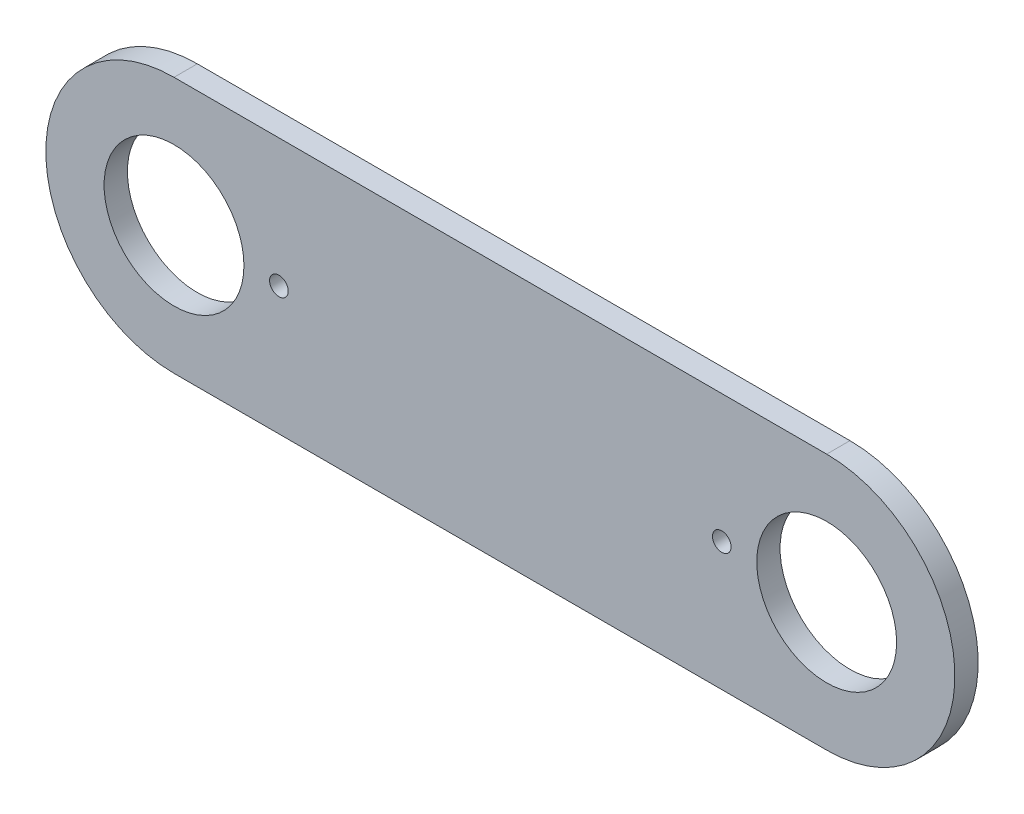
ISO-10303-21;
HEADER;
FILE_DESCRIPTION(('STEP AP214'),'2;1');
FILE_NAME('part.step','',(''),(''),'','','');
FILE_SCHEMA(('AUTOMOTIVE_DESIGN { 1 0 10303 214 1 1 1 1 }'));
ENDSEC;
DATA;
#1=APPLICATION_CONTEXT('core data for automotive mechanical design processes');
#2=APPLICATION_PROTOCOL_DEFINITION('international standard','automotive_design',2000,#1);
#3=PRODUCT_CONTEXT('',#1,'mechanical');
#4=PRODUCT('Part','Part','',(#3));
#5=PRODUCT_RELATED_PRODUCT_CATEGORY('part','',(#4));
#6=PRODUCT_DEFINITION_FORMATION('','',#4);
#7=PRODUCT_DEFINITION_CONTEXT('part definition',#1,'design');
#8=PRODUCT_DEFINITION('design','',#6,#7);
#9=PRODUCT_DEFINITION_SHAPE('','',#8);
#10=(LENGTH_UNIT() NAMED_UNIT(*) SI_UNIT(.MILLI.,.METRE.));
#11=(NAMED_UNIT(*) PLANE_ANGLE_UNIT() SI_UNIT($,.RADIAN.));
#12=(NAMED_UNIT(*) SI_UNIT($,.STERADIAN.) SOLID_ANGLE_UNIT());
#13=UNCERTAINTY_MEASURE_WITH_UNIT(LENGTH_MEASURE(1.E-05),#10,'distance_accuracy_value','');
#14=(GEOMETRIC_REPRESENTATION_CONTEXT(3) GLOBAL_UNCERTAINTY_ASSIGNED_CONTEXT((#13)) GLOBAL_UNIT_ASSIGNED_CONTEXT((#10,
#11,#12)) REPRESENTATION_CONTEXT('',''));
#15=CARTESIAN_POINT('',(0.,0.,0.));
#16=DIRECTION('',(0.,0.,1.));
#17=DIRECTION('',(1.,0.,0.));
#18=AXIS2_PLACEMENT_3D('',#15,#16,#17);
#19=CARTESIAN_POINT('',(0.,0.,5.));
#20=DIRECTION('',(0.,0.,1.));
#21=DIRECTION('',(1.,0.,0.));
#22=AXIS2_PLACEMENT_3D('',#19,#20,#21);
#23=PLANE('',#22);
#24=CARTESIAN_POINT('',(22.5,0.,5.));
#25=DIRECTION('',(0.,0.,1.));
#26=DIRECTION('',(1.,0.,0.));
#27=AXIS2_PLACEMENT_3D('',#24,#25,#26);
#28=CIRCLE('',#27,2.);
#29=CARTESIAN_POINT('',(24.5,0.,5.));
#30=VERTEX_POINT('',#29);
#31=EDGE_CURVE('E131',#30,#30,#28,.T.);
#32=ORIENTED_EDGE('',*,*,#31,.F.);
#33=EDGE_LOOP('',(#32));
#34=FACE_BOUND('',#33,.T.);
#35=CARTESIAN_POINT('',(0.,0.,5.));
#36=DIRECTION('',(0.,0.,1.));
#37=DIRECTION('',(1.,0.,0.));
#38=AXIS2_PLACEMENT_3D('',#35,#36,#37);
#39=CIRCLE('',#38,15.);
#40=CARTESIAN_POINT('',(15.,0.,5.));
#41=VERTEX_POINT('',#40);
#42=EDGE_CURVE('E110',#41,#41,#39,.T.);
#43=ORIENTED_EDGE('',*,*,#42,.F.);
#44=EDGE_LOOP('',(#43));
#45=FACE_BOUND('',#44,.T.);
#46=CARTESIAN_POINT('',(0.,0.,5.));
#47=DIRECTION('',(0.,0.,1.));
#48=DIRECTION('',(1.,0.,0.));
#49=AXIS2_PLACEMENT_3D('',#46,#47,#48);
#50=CIRCLE('',#49,27.5);
#51=CARTESIAN_POINT('',(0.,27.5,5.));
#52=VERTEX_POINT('',#51);
#53=CARTESIAN_POINT('',(0.,-27.5,5.));
#54=VERTEX_POINT('',#53);
#55=EDGE_CURVE('E95',#52,#54,#50,.T.);
#56=ORIENTED_EDGE('',*,*,#55,.T.);
#57=DIRECTION('',(1.,0.,0.));
#58=VECTOR('',#57,1.);
#59=CARTESIAN_POINT('',(0.,-27.5,5.));
#60=LINE('',#59,#58);
#61=CARTESIAN_POINT('',(140.,-27.5,5.));
#62=VERTEX_POINT('',#61);
#63=EDGE_CURVE('E90',#54,#62,#60,.T.);
#64=ORIENTED_EDGE('',*,*,#63,.T.);
#65=CARTESIAN_POINT('',(140.,0.,5.));
#66=DIRECTION('',(0.,0.,1.));
#67=DIRECTION('',(1.,0.,0.));
#68=AXIS2_PLACEMENT_3D('',#65,#66,#67);
#69=CIRCLE('',#68,27.5);
#70=CARTESIAN_POINT('',(140.,27.5,5.));
#71=VERTEX_POINT('',#70);
#72=EDGE_CURVE('E93',#62,#71,#69,.T.);
#73=ORIENTED_EDGE('',*,*,#72,.T.);
#74=DIRECTION('',(-1.,0.,0.));
#75=VECTOR('',#74,1.);
#76=CARTESIAN_POINT('',(0.,27.5,5.));
#77=LINE('',#76,#75);
#78=EDGE_CURVE('E60',#71,#52,#77,.T.);
#79=ORIENTED_EDGE('',*,*,#78,.T.);
#80=EDGE_LOOP('',(#56,#64,#73,#79));
#81=FACE_BOUND('',#80,.T.);
#82=CARTESIAN_POINT('',(140.,0.,5.));
#83=DIRECTION('',(0.,0.,1.));
#84=DIRECTION('',(1.,0.,0.));
#85=AXIS2_PLACEMENT_3D('',#82,#83,#84);
#86=CIRCLE('',#85,15.);
#87=CARTESIAN_POINT('',(155.,0.,5.));
#88=VERTEX_POINT('',#87);
#89=EDGE_CURVE('E125',#88,#88,#86,.T.);
#90=ORIENTED_EDGE('',*,*,#89,.F.);
#91=EDGE_LOOP('',(#90));
#92=FACE_BOUND('',#91,.T.);
#93=CARTESIAN_POINT('',(117.5,0.,5.));
#94=DIRECTION('',(0.,0.,1.));
#95=DIRECTION('',(1.,0.,0.));
#96=AXIS2_PLACEMENT_3D('',#93,#94,#95);
#97=CIRCLE('',#96,2.);
#98=CARTESIAN_POINT('',(119.5,0.,5.));
#99=VERTEX_POINT('',#98);
#100=EDGE_CURVE('E137',#99,#99,#97,.T.);
#101=ORIENTED_EDGE('',*,*,#100,.F.);
#102=EDGE_LOOP('',(#101));
#103=FACE_BOUND('',#102,.T.);
#104=ADVANCED_FACE('F43',(#34,#45,#81,#92,#103),#23,.T.);
#105=CARTESIAN_POINT('',(0.,0.,0.));
#106=DIRECTION('',(0.,0.,1.));
#107=DIRECTION('',(1.,0.,0.));
#108=AXIS2_PLACEMENT_3D('',#105,#106,#107);
#109=PLANE('',#108);
#110=CARTESIAN_POINT('',(0.,0.,0.));
#111=DIRECTION('',(0.,0.,1.));
#112=DIRECTION('',(1.,0.,0.));
#113=AXIS2_PLACEMENT_3D('',#110,#111,#112);
#114=CIRCLE('',#113,27.5);
#115=CARTESIAN_POINT('',(0.,27.5,0.));
#116=VERTEX_POINT('',#115);
#117=CARTESIAN_POINT('',(0.,-27.5,0.));
#118=VERTEX_POINT('',#117);
#119=EDGE_CURVE('E107',#116,#118,#114,.T.);
#120=ORIENTED_EDGE('',*,*,#119,.F.);
#121=DIRECTION('',(-1.,0.,0.));
#122=VECTOR('',#121,1.);
#123=CARTESIAN_POINT('',(0.,27.5,0.));
#124=LINE('',#123,#122);
#125=CARTESIAN_POINT('',(140.,27.5,0.));
#126=VERTEX_POINT('',#125);
#127=EDGE_CURVE('E83',#126,#116,#124,.T.);
#128=ORIENTED_EDGE('',*,*,#127,.F.);
#129=CARTESIAN_POINT('',(140.,0.,0.));
#130=DIRECTION('',(0.,0.,1.));
#131=DIRECTION('',(1.,0.,0.));
#132=AXIS2_PLACEMENT_3D('',#129,#130,#131);
#133=CIRCLE('',#132,27.5);
#134=CARTESIAN_POINT('',(140.,-27.5,0.));
#135=VERTEX_POINT('',#134);
#136=EDGE_CURVE('E77',#135,#126,#133,.T.);
#137=ORIENTED_EDGE('',*,*,#136,.F.);
#138=DIRECTION('',(1.,0.,0.));
#139=VECTOR('',#138,1.);
#140=CARTESIAN_POINT('',(0.,-27.5,0.));
#141=LINE('',#140,#139);
#142=EDGE_CURVE('E99',#118,#135,#141,.T.);
#143=ORIENTED_EDGE('',*,*,#142,.F.);
#144=EDGE_LOOP('',(#120,#128,#137,#143));
#145=FACE_BOUND('',#144,.T.);
#146=CARTESIAN_POINT('',(0.,0.,0.));
#147=DIRECTION('',(0.,0.,1.));
#148=DIRECTION('',(1.,0.,0.));
#149=AXIS2_PLACEMENT_3D('',#146,#147,#148);
#150=CIRCLE('',#149,15.);
#151=CARTESIAN_POINT('',(15.,0.,0.));
#152=VERTEX_POINT('',#151);
#153=EDGE_CURVE('E122',#152,#152,#150,.T.);
#154=ORIENTED_EDGE('',*,*,#153,.T.);
#155=EDGE_LOOP('',(#154));
#156=FACE_BOUND('',#155,.T.);
#157=CARTESIAN_POINT('',(140.,0.,0.));
#158=DIRECTION('',(0.,0.,1.));
#159=DIRECTION('',(1.,0.,0.));
#160=AXIS2_PLACEMENT_3D('',#157,#158,#159);
#161=CIRCLE('',#160,15.);
#162=CARTESIAN_POINT('',(155.,0.,0.));
#163=VERTEX_POINT('',#162);
#164=EDGE_CURVE('E128',#163,#163,#161,.T.);
#165=ORIENTED_EDGE('',*,*,#164,.T.);
#166=EDGE_LOOP('',(#165));
#167=FACE_BOUND('',#166,.T.);
#168=CARTESIAN_POINT('',(22.5,0.,0.));
#169=DIRECTION('',(0.,0.,1.));
#170=DIRECTION('',(1.,0.,0.));
#171=AXIS2_PLACEMENT_3D('',#168,#169,#170);
#172=CIRCLE('',#171,2.);
#173=CARTESIAN_POINT('',(24.5,0.,0.));
#174=VERTEX_POINT('',#173);
#175=EDGE_CURVE('E134',#174,#174,#172,.T.);
#176=ORIENTED_EDGE('',*,*,#175,.T.);
#177=EDGE_LOOP('',(#176));
#178=FACE_BOUND('',#177,.T.);
#179=CARTESIAN_POINT('',(117.5,0.,0.));
#180=DIRECTION('',(0.,0.,1.));
#181=DIRECTION('',(1.,0.,0.));
#182=AXIS2_PLACEMENT_3D('',#179,#180,#181);
#183=CIRCLE('',#182,2.);
#184=CARTESIAN_POINT('',(119.5,0.,0.));
#185=VERTEX_POINT('',#184);
#186=EDGE_CURVE('E140',#185,#185,#183,.T.);
#187=ORIENTED_EDGE('',*,*,#186,.T.);
#188=EDGE_LOOP('',(#187));
#189=FACE_BOUND('',#188,.T.);
#190=ADVANCED_FACE('F118',(#145,#156,#167,#178,#189),#109,.F.);
#191=CARTESIAN_POINT('',(0.,0.,5.));
#192=DIRECTION('',(0.,0.,-1.));
#193=DIRECTION('',(-1.,0.,0.));
#194=AXIS2_PLACEMENT_3D('',#191,#192,#193);
#195=CYLINDRICAL_SURFACE('',#194,27.5);
#196=ORIENTED_EDGE('',*,*,#119,.T.);
#197=DIRECTION('',(0.,0.,-1.));
#198=VECTOR('',#197,1.);
#199=CARTESIAN_POINT('',(0.,-27.5,5.));
#200=LINE('',#199,#198);
#201=EDGE_CURVE('E11',#54,#118,#200,.T.);
#202=ORIENTED_EDGE('',*,*,#201,.F.);
#203=ORIENTED_EDGE('',*,*,#55,.F.);
#204=DIRECTION('',(0.,0.,-1.));
#205=VECTOR('',#204,1.);
#206=CARTESIAN_POINT('',(0.,27.5,5.));
#207=LINE('',#206,#205);
#208=EDGE_CURVE('E103',#52,#116,#207,.T.);
#209=ORIENTED_EDGE('',*,*,#208,.T.);
#210=EDGE_LOOP('',(#196,#202,#203,#209));
#211=FACE_BOUND('',#210,.T.);
#212=ADVANCED_FACE('F45',(#211),#195,.T.);
#213=CARTESIAN_POINT('',(0.,-27.5,5.));
#214=DIRECTION('',(0.,1.,0.));
#215=DIRECTION('',(0.,0.,1.));
#216=AXIS2_PLACEMENT_3D('',#213,#214,#215);
#217=PLANE('',#216);
#218=ORIENTED_EDGE('',*,*,#142,.T.);
#219=DIRECTION('',(0.,0.,-1.));
#220=VECTOR('',#219,1.);
#221=CARTESIAN_POINT('',(140.,-27.5,5.));
#222=LINE('',#221,#220);
#223=EDGE_CURVE('E52',#62,#135,#222,.T.);
#224=ORIENTED_EDGE('',*,*,#223,.F.);
#225=ORIENTED_EDGE('',*,*,#63,.F.);
#226=ORIENTED_EDGE('',*,*,#201,.T.);
#227=EDGE_LOOP('',(#218,#224,#225,#226));
#228=FACE_BOUND('',#227,.T.);
#229=ADVANCED_FACE('F98',(#228),#217,.F.);
#230=CARTESIAN_POINT('',(140.,0.,5.));
#231=DIRECTION('',(0.,0.,-1.));
#232=DIRECTION('',(-1.,0.,0.));
#233=AXIS2_PLACEMENT_3D('',#230,#231,#232);
#234=CYLINDRICAL_SURFACE('',#233,27.5);
#235=ORIENTED_EDGE('',*,*,#136,.T.);
#236=DIRECTION('',(0.,0.,-1.));
#237=VECTOR('',#236,1.);
#238=CARTESIAN_POINT('',(140.,27.5,5.));
#239=LINE('',#238,#237);
#240=EDGE_CURVE('E100',#71,#126,#239,.T.);
#241=ORIENTED_EDGE('',*,*,#240,.F.);
#242=ORIENTED_EDGE('',*,*,#72,.F.);
#243=ORIENTED_EDGE('',*,*,#223,.T.);
#244=EDGE_LOOP('',(#235,#241,#242,#243));
#245=FACE_BOUND('',#244,.T.);
#246=ADVANCED_FACE('F101',(#245),#234,.T.);
#247=CARTESIAN_POINT('',(0.,27.5,5.));
#248=DIRECTION('',(0.,-1.,0.));
#249=DIRECTION('',(0.,0.,-1.));
#250=AXIS2_PLACEMENT_3D('',#247,#248,#249);
#251=PLANE('',#250);
#252=ORIENTED_EDGE('',*,*,#127,.T.);
#253=ORIENTED_EDGE('',*,*,#208,.F.);
#254=ORIENTED_EDGE('',*,*,#78,.F.);
#255=ORIENTED_EDGE('',*,*,#240,.T.);
#256=EDGE_LOOP('',(#252,#253,#254,#255));
#257=FACE_BOUND('',#256,.T.);
#258=ADVANCED_FACE('F115',(#257),#251,.F.);
#259=CARTESIAN_POINT('',(0.,0.,5.));
#260=DIRECTION('',(0.,0.,-1.));
#261=DIRECTION('',(-1.,0.,0.));
#262=AXIS2_PLACEMENT_3D('',#259,#260,#261);
#263=CYLINDRICAL_SURFACE('',#262,15.);
#264=ORIENTED_EDGE('',*,*,#42,.T.);
#265=EDGE_LOOP('',(#264));
#266=FACE_BOUND('',#265,.T.);
#267=ORIENTED_EDGE('',*,*,#153,.F.);
#268=EDGE_LOOP('',(#267));
#269=FACE_BOUND('',#268,.T.);
#270=ADVANCED_FACE('F159',(#266,#269),#263,.F.);
#271=CARTESIAN_POINT('',(140.,0.,5.));
#272=DIRECTION('',(0.,0.,-1.));
#273=DIRECTION('',(-1.,0.,0.));
#274=AXIS2_PLACEMENT_3D('',#271,#272,#273);
#275=CYLINDRICAL_SURFACE('',#274,15.);
#276=ORIENTED_EDGE('',*,*,#89,.T.);
#277=EDGE_LOOP('',(#276));
#278=FACE_BOUND('',#277,.T.);
#279=ORIENTED_EDGE('',*,*,#164,.F.);
#280=EDGE_LOOP('',(#279));
#281=FACE_BOUND('',#280,.T.);
#282=ADVANCED_FACE('F213',(#278,#281),#275,.F.);
#283=CARTESIAN_POINT('',(22.5,0.,5.));
#284=DIRECTION('',(0.,0.,-1.));
#285=DIRECTION('',(-1.,0.,0.));
#286=AXIS2_PLACEMENT_3D('',#283,#284,#285);
#287=CYLINDRICAL_SURFACE('',#286,2.);
#288=ORIENTED_EDGE('',*,*,#31,.T.);
#289=EDGE_LOOP('',(#288));
#290=FACE_BOUND('',#289,.T.);
#291=ORIENTED_EDGE('',*,*,#175,.F.);
#292=EDGE_LOOP('',(#291));
#293=FACE_BOUND('',#292,.T.);
#294=ADVANCED_FACE('F222',(#290,#293),#287,.F.);
#295=CARTESIAN_POINT('',(117.5,0.,5.));
#296=DIRECTION('',(0.,0.,-1.));
#297=DIRECTION('',(-1.,0.,0.));
#298=AXIS2_PLACEMENT_3D('',#295,#296,#297);
#299=CYLINDRICAL_SURFACE('',#298,2.);
#300=ORIENTED_EDGE('',*,*,#100,.T.);
#301=EDGE_LOOP('',(#300));
#302=FACE_BOUND('',#301,.T.);
#303=ORIENTED_EDGE('',*,*,#186,.F.);
#304=EDGE_LOOP('',(#303));
#305=FACE_BOUND('',#304,.T.);
#306=ADVANCED_FACE('F146',(#302,#305),#299,.F.);
#307=CLOSED_SHELL('',(#104,#190,#212,#229,#246,#258,#270,#282,#294,#306));
#308=MANIFOLD_SOLID_BREP('B2',#307);
#309=ADVANCED_BREP_SHAPE_REPRESENTATION('',(#18,#308),#14);
#310=SHAPE_DEFINITION_REPRESENTATION(#9,#309);
ENDSEC;
END-ISO-10303-21;
